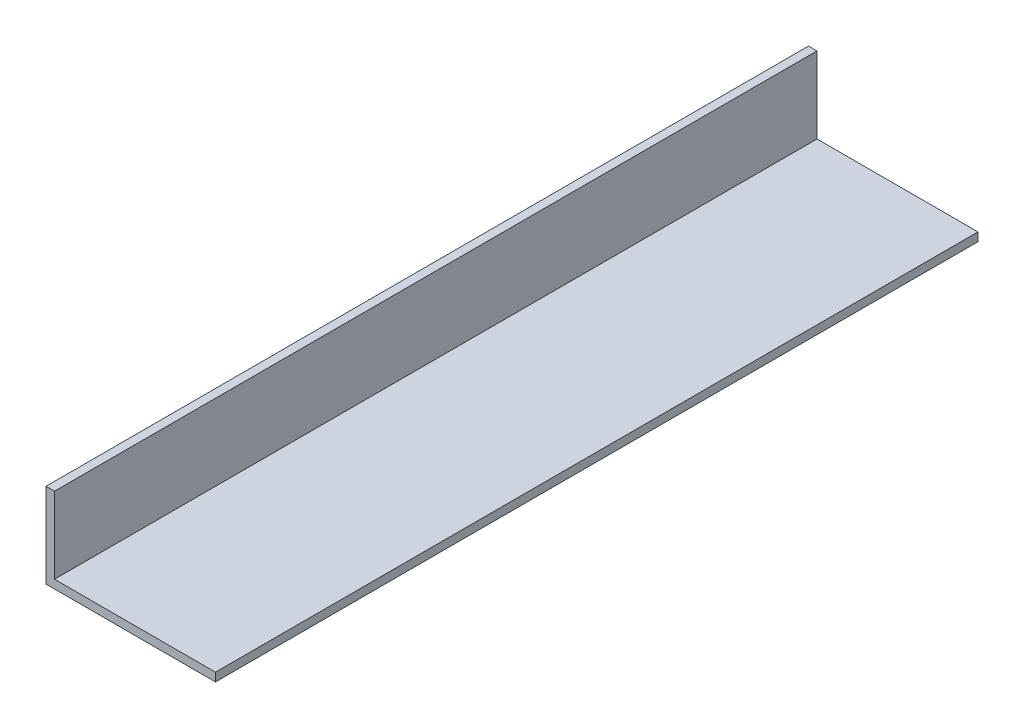
ISO-10303-21;
HEADER;
FILE_DESCRIPTION(('STEP AP214'),'2;1');
FILE_NAME('part.step','',(''),(''),'','','');
FILE_SCHEMA(('AUTOMOTIVE_DESIGN { 1 0 10303 214 1 1 1 1 }'));
ENDSEC;
DATA;
#1=APPLICATION_CONTEXT('core data for automotive mechanical design processes');
#2=APPLICATION_PROTOCOL_DEFINITION('international standard','automotive_design',2000,#1);
#3=PRODUCT_CONTEXT('',#1,'mechanical');
#4=PRODUCT('Part','Part','',(#3));
#5=PRODUCT_RELATED_PRODUCT_CATEGORY('part','',(#4));
#6=PRODUCT_DEFINITION_FORMATION('','',#4);
#7=PRODUCT_DEFINITION_CONTEXT('part definition',#1,'design');
#8=PRODUCT_DEFINITION('design','',#6,#7);
#9=PRODUCT_DEFINITION_SHAPE('','',#8);
#10=(LENGTH_UNIT() NAMED_UNIT(*) SI_UNIT(.MILLI.,.METRE.));
#11=(NAMED_UNIT(*) PLANE_ANGLE_UNIT() SI_UNIT($,.RADIAN.));
#12=(NAMED_UNIT(*) SI_UNIT($,.STERADIAN.) SOLID_ANGLE_UNIT());
#13=UNCERTAINTY_MEASURE_WITH_UNIT(LENGTH_MEASURE(1.E-05),#10,'distance_accuracy_value','');
#14=(GEOMETRIC_REPRESENTATION_CONTEXT(3) GLOBAL_UNCERTAINTY_ASSIGNED_CONTEXT((#13)) GLOBAL_UNIT_ASSIGNED_CONTEXT((#10,
#11,#12)) REPRESENTATION_CONTEXT('',''));
#15=CARTESIAN_POINT('',(0.,0.,0.));
#16=DIRECTION('',(0.,0.,1.));
#17=DIRECTION('',(1.,0.,0.));
#18=AXIS2_PLACEMENT_3D('',#15,#16,#17);
#19=CARTESIAN_POINT('',(-69.5798319327731,11.327731092437,180.));
#20=DIRECTION('',(1.,0.,0.));
#21=DIRECTION('',(0.,0.,-1.));
#22=AXIS2_PLACEMENT_3D('',#19,#20,#21);
#23=PLANE('',#22);
#24=DIRECTION('',(0.,-1.,0.));
#25=VECTOR('',#24,1.);
#26=CARTESIAN_POINT('',(-69.5798319327731,11.327731092437,0.));
#27=LINE('',#26,#25);
#28=CARTESIAN_POINT('',(-69.5798319327731,29.327731092437,0.));
#29=VERTEX_POINT('',#28);
#30=CARTESIAN_POINT('',(-69.5798319327731,9.32773109243698,0.));
#31=VERTEX_POINT('',#30);
#32=EDGE_CURVE('E86',#29,#31,#27,.T.);
#33=ORIENTED_EDGE('',*,*,#32,.T.);
#34=DIRECTION('',(0.,0.,-1.));
#35=VECTOR('',#34,1.);
#36=CARTESIAN_POINT('',(-69.5798319327731,9.32773109243698,180.));
#37=LINE('',#36,#35);
#38=CARTESIAN_POINT('',(-69.5798319327731,9.32773109243698,180.));
#39=VERTEX_POINT('',#38);
#40=EDGE_CURVE('E11',#39,#31,#37,.T.);
#41=ORIENTED_EDGE('',*,*,#40,.F.);
#42=DIRECTION('',(0.,-1.,0.));
#43=VECTOR('',#42,1.);
#44=CARTESIAN_POINT('',(-69.5798319327731,29.327731092437,180.));
#45=LINE('',#44,#43);
#46=CARTESIAN_POINT('',(-69.5798319327731,29.327731092437,180.));
#47=VERTEX_POINT('',#46);
#48=EDGE_CURVE('E92',#47,#39,#45,.T.);
#49=ORIENTED_EDGE('',*,*,#48,.F.);
#50=DIRECTION('',(0.,0.,-1.));
#51=VECTOR('',#50,1.);
#52=CARTESIAN_POINT('',(-69.5798319327731,29.327731092437,180.));
#53=LINE('',#52,#51);
#54=EDGE_CURVE('E124',#47,#29,#53,.T.);
#55=ORIENTED_EDGE('',*,*,#54,.T.);
#56=EDGE_LOOP('',(#33,#41,#49,#55));
#57=FACE_BOUND('',#56,.T.);
#58=ADVANCED_FACE('F39',(#57),#23,.F.);
#59=CARTESIAN_POINT('',(-69.5798319327731,9.32773109243698,180.));
#60=DIRECTION('',(0.,1.,0.));
#61=DIRECTION('',(0.,0.,1.));
#62=AXIS2_PLACEMENT_3D('',#59,#60,#61);
#63=PLANE('',#62);
#64=DIRECTION('',(1.,0.,0.));
#65=VECTOR('',#64,1.);
#66=CARTESIAN_POINT('',(-69.5798319327731,9.32773109243698,0.));
#67=LINE('',#66,#65);
#68=CARTESIAN_POINT('',(-29.5798319327731,9.32773109243698,0.));
#69=VERTEX_POINT('',#68);
#70=EDGE_CURVE('E130',#31,#69,#67,.T.);
#71=ORIENTED_EDGE('',*,*,#70,.T.);
#72=DIRECTION('',(0.,0.,-1.));
#73=VECTOR('',#72,1.);
#74=CARTESIAN_POINT('',(-29.5798319327731,9.32773109243698,180.));
#75=LINE('',#74,#73);
#76=CARTESIAN_POINT('',(-29.5798319327731,9.32773109243698,180.));
#77=VERTEX_POINT('',#76);
#78=EDGE_CURVE('E48',#77,#69,#75,.T.);
#79=ORIENTED_EDGE('',*,*,#78,.F.);
#80=DIRECTION('',(1.,0.,0.));
#81=VECTOR('',#80,1.);
#82=CARTESIAN_POINT('',(-69.5798319327731,9.32773109243698,180.));
#83=LINE('',#82,#81);
#84=EDGE_CURVE('E162',#39,#77,#83,.T.);
#85=ORIENTED_EDGE('',*,*,#84,.F.);
#86=ORIENTED_EDGE('',*,*,#40,.T.);
#87=EDGE_LOOP('',(#71,#79,#85,#86));
#88=FACE_BOUND('',#87,.T.);
#89=ADVANCED_FACE('F167',(#88),#63,.F.);
#90=CARTESIAN_POINT('',(-29.5798319327731,11.327731092437,180.));
#91=DIRECTION('',(-1.,0.,0.));
#92=DIRECTION('',(0.,-1.,0.));
#93=AXIS2_PLACEMENT_3D('',#90,#91,#92);
#94=PLANE('',#93);
#95=DIRECTION('',(0.,1.,0.));
#96=VECTOR('',#95,1.);
#97=CARTESIAN_POINT('',(-29.5798319327731,11.327731092437,0.));
#98=LINE('',#97,#96);
#99=CARTESIAN_POINT('',(-29.5798319327731,11.327731092437,0.));
#100=VERTEX_POINT('',#99);
#101=EDGE_CURVE('E133',#69,#100,#98,.T.);
#102=ORIENTED_EDGE('',*,*,#101,.T.);
#103=DIRECTION('',(0.,0.,-1.));
#104=VECTOR('',#103,1.);
#105=CARTESIAN_POINT('',(-29.5798319327731,11.327731092437,180.));
#106=LINE('',#105,#104);
#107=CARTESIAN_POINT('',(-29.5798319327731,11.327731092437,180.));
#108=VERTEX_POINT('',#107);
#109=EDGE_CURVE('E117',#108,#100,#106,.T.);
#110=ORIENTED_EDGE('',*,*,#109,.F.);
#111=DIRECTION('',(0.,1.,0.));
#112=VECTOR('',#111,1.);
#113=CARTESIAN_POINT('',(-29.5798319327731,11.327731092437,180.));
#114=LINE('',#113,#112);
#115=EDGE_CURVE('E106',#77,#108,#114,.T.);
#116=ORIENTED_EDGE('',*,*,#115,.F.);
#117=ORIENTED_EDGE('',*,*,#78,.T.);
#118=EDGE_LOOP('',(#102,#110,#116,#117));
#119=FACE_BOUND('',#118,.T.);
#120=ADVANCED_FACE('F154',(#119),#94,.F.);
#121=CARTESIAN_POINT('',(-67.5798319327731,11.327731092437,180.));
#122=DIRECTION('',(0.,-1.,0.));
#123=DIRECTION('',(0.,0.,-1.));
#124=AXIS2_PLACEMENT_3D('',#121,#122,#123);
#125=PLANE('',#124);
#126=DIRECTION('',(-1.,0.,0.));
#127=VECTOR('',#126,1.);
#128=CARTESIAN_POINT('',(-67.5798319327731,11.327731092437,0.));
#129=LINE('',#128,#127);
#130=CARTESIAN_POINT('',(-67.5798319327731,11.327731092437,0.));
#131=VERTEX_POINT('',#130);
#132=EDGE_CURVE('E115',#100,#131,#129,.T.);
#133=ORIENTED_EDGE('',*,*,#132,.T.);
#134=DIRECTION('',(0.,0.,-1.));
#135=VECTOR('',#134,1.);
#136=CARTESIAN_POINT('',(-67.5798319327731,11.327731092437,180.));
#137=LINE('',#136,#135);
#138=CARTESIAN_POINT('',(-67.5798319327731,11.327731092437,180.));
#139=VERTEX_POINT('',#138);
#140=EDGE_CURVE('E112',#139,#131,#137,.T.);
#141=ORIENTED_EDGE('',*,*,#140,.F.);
#142=DIRECTION('',(-1.,0.,0.));
#143=VECTOR('',#142,1.);
#144=CARTESIAN_POINT('',(-67.5798319327731,11.327731092437,180.));
#145=LINE('',#144,#143);
#146=EDGE_CURVE('E100',#108,#139,#145,.T.);
#147=ORIENTED_EDGE('',*,*,#146,.F.);
#148=ORIENTED_EDGE('',*,*,#109,.T.);
#149=EDGE_LOOP('',(#133,#141,#147,#148));
#150=FACE_BOUND('',#149,.T.);
#151=ADVANCED_FACE('F113',(#150),#125,.F.);
#152=CARTESIAN_POINT('',(-67.5798319327731,29.327731092437,180.));
#153=DIRECTION('',(-1.,0.,0.));
#154=DIRECTION('',(0.,0.,1.));
#155=AXIS2_PLACEMENT_3D('',#152,#153,#154);
#156=PLANE('',#155);
#157=DIRECTION('',(0.,1.,0.));
#158=VECTOR('',#157,1.);
#159=CARTESIAN_POINT('',(-67.5798319327731,29.327731092437,0.));
#160=LINE('',#159,#158);
#161=CARTESIAN_POINT('',(-67.5798319327731,29.327731092437,0.));
#162=VERTEX_POINT('',#161);
#163=EDGE_CURVE('E79',#131,#162,#160,.T.);
#164=ORIENTED_EDGE('',*,*,#163,.T.);
#165=DIRECTION('',(0.,0.,-1.));
#166=VECTOR('',#165,1.);
#167=CARTESIAN_POINT('',(-67.5798319327731,29.327731092437,180.));
#168=LINE('',#167,#166);
#169=CARTESIAN_POINT('',(-67.5798319327731,29.327731092437,180.));
#170=VERTEX_POINT('',#169);
#171=EDGE_CURVE('E118',#170,#162,#168,.T.);
#172=ORIENTED_EDGE('',*,*,#171,.F.);
#173=DIRECTION('',(0.,1.,0.));
#174=VECTOR('',#173,1.);
#175=CARTESIAN_POINT('',(-67.5798319327731,29.327731092437,180.));
#176=LINE('',#175,#174);
#177=EDGE_CURVE('E104',#139,#170,#176,.T.);
#178=ORIENTED_EDGE('',*,*,#177,.F.);
#179=ORIENTED_EDGE('',*,*,#140,.T.);
#180=EDGE_LOOP('',(#164,#172,#178,#179));
#181=FACE_BOUND('',#180,.T.);
#182=ADVANCED_FACE('F120',(#181),#156,.F.);
#183=CARTESIAN_POINT('',(-69.5798319327731,29.327731092437,180.));
#184=DIRECTION('',(0.,-1.,0.));
#185=DIRECTION('',(0.,0.,-1.));
#186=AXIS2_PLACEMENT_3D('',#183,#184,#185);
#187=PLANE('',#186);
#188=DIRECTION('',(-1.,0.,0.));
#189=VECTOR('',#188,1.);
#190=CARTESIAN_POINT('',(-69.5798319327731,29.327731092437,0.));
#191=LINE('',#190,#189);
#192=EDGE_CURVE('E140',#162,#29,#191,.T.);
#193=ORIENTED_EDGE('',*,*,#192,.T.);
#194=ORIENTED_EDGE('',*,*,#54,.F.);
#195=DIRECTION('',(-1.,0.,0.));
#196=VECTOR('',#195,1.);
#197=CARTESIAN_POINT('',(-69.5798319327731,29.327731092437,180.));
#198=LINE('',#197,#196);
#199=EDGE_CURVE('E56',#170,#47,#198,.T.);
#200=ORIENTED_EDGE('',*,*,#199,.F.);
#201=ORIENTED_EDGE('',*,*,#171,.T.);
#202=EDGE_LOOP('',(#193,#194,#200,#201));
#203=FACE_BOUND('',#202,.T.);
#204=ADVANCED_FACE('F159',(#203),#187,.F.);
#205=CARTESIAN_POINT('',(0.,0.,180.));
#206=DIRECTION('',(0.,0.,1.));
#207=DIRECTION('',(1.,0.,0.));
#208=AXIS2_PLACEMENT_3D('',#205,#206,#207);
#209=PLANE('',#208);
#210=ORIENTED_EDGE('',*,*,#48,.T.);
#211=ORIENTED_EDGE('',*,*,#84,.T.);
#212=ORIENTED_EDGE('',*,*,#115,.T.);
#213=ORIENTED_EDGE('',*,*,#146,.T.);
#214=ORIENTED_EDGE('',*,*,#177,.T.);
#215=ORIENTED_EDGE('',*,*,#199,.T.);
#216=EDGE_LOOP('',(#210,#211,#212,#213,#214,#215));
#217=FACE_BOUND('',#216,.T.);
#218=ADVANCED_FACE('F102',(#217),#209,.T.);
#219=CARTESIAN_POINT('',(0.,0.,0.));
#220=DIRECTION('',(0.,0.,1.));
#221=DIRECTION('',(1.,0.,0.));
#222=AXIS2_PLACEMENT_3D('',#219,#220,#221);
#223=PLANE('',#222);
#224=ORIENTED_EDGE('',*,*,#32,.F.);
#225=ORIENTED_EDGE('',*,*,#192,.F.);
#226=ORIENTED_EDGE('',*,*,#163,.F.);
#227=ORIENTED_EDGE('',*,*,#132,.F.);
#228=ORIENTED_EDGE('',*,*,#101,.F.);
#229=ORIENTED_EDGE('',*,*,#70,.F.);
#230=EDGE_LOOP('',(#224,#225,#226,#227,#228,#229));
#231=FACE_BOUND('',#230,.T.);
#232=ADVANCED_FACE('F157',(#231),#223,.F.);
#233=CLOSED_SHELL('',(#58,#89,#120,#151,#182,#204,#218,#232));
#234=MANIFOLD_SOLID_BREP('B2',#233);
#235=ADVANCED_BREP_SHAPE_REPRESENTATION('',(#18,#234),#14);
#236=SHAPE_DEFINITION_REPRESENTATION(#9,#235);
ENDSEC;
END-ISO-10303-21;
